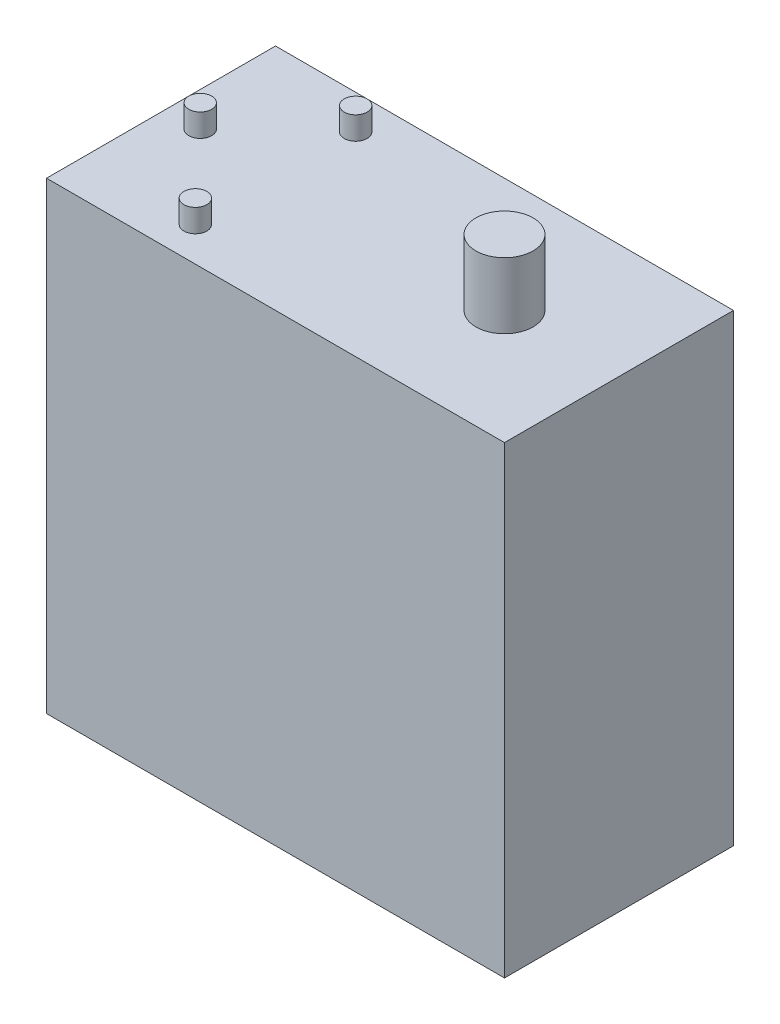
ISO-10303-21;
HEADER;
FILE_DESCRIPTION(('STEP AP214'),'2;1');
FILE_NAME('part.step','',(''),(''),'','','');
FILE_SCHEMA(('AUTOMOTIVE_DESIGN { 1 0 10303 214 1 1 1 1 }'));
ENDSEC;
DATA;
#1=APPLICATION_CONTEXT('core data for automotive mechanical design processes');
#2=APPLICATION_PROTOCOL_DEFINITION('international standard','automotive_design',2000,#1);
#3=PRODUCT_CONTEXT('',#1,'mechanical');
#4=PRODUCT('Part','Part','',(#3));
#5=PRODUCT_RELATED_PRODUCT_CATEGORY('part','',(#4));
#6=PRODUCT_DEFINITION_FORMATION('','',#4);
#7=PRODUCT_DEFINITION_CONTEXT('part definition',#1,'design');
#8=PRODUCT_DEFINITION('design','',#6,#7);
#9=PRODUCT_DEFINITION_SHAPE('','',#8);
#10=(LENGTH_UNIT() NAMED_UNIT(*) SI_UNIT(.MILLI.,.METRE.));
#11=(NAMED_UNIT(*) PLANE_ANGLE_UNIT() SI_UNIT($,.RADIAN.));
#12=(NAMED_UNIT(*) SI_UNIT($,.STERADIAN.) SOLID_ANGLE_UNIT());
#13=UNCERTAINTY_MEASURE_WITH_UNIT(LENGTH_MEASURE(1.E-05),#10,'distance_accuracy_value','');
#14=(GEOMETRIC_REPRESENTATION_CONTEXT(3) GLOBAL_UNCERTAINTY_ASSIGNED_CONTEXT((#13)) GLOBAL_UNIT_ASSIGNED_CONTEXT((#10,
#11,#12)) REPRESENTATION_CONTEXT('',''));
#15=CARTESIAN_POINT('',(0.,0.,0.));
#16=DIRECTION('',(0.,0.,1.));
#17=DIRECTION('',(1.,0.,0.));
#18=AXIS2_PLACEMENT_3D('',#15,#16,#17);
#19=CARTESIAN_POINT('',(-16.2432620080768,40.5,-10.7539016762014));
#20=DIRECTION('',(1.,0.,0.));
#21=DIRECTION('',(0.,0.,-1.));
#22=AXIS2_PLACEMENT_3D('',#19,#20,#21);
#23=PLANE('',#22);
#24=DIRECTION('',(0.,0.,1.));
#25=VECTOR('',#24,1.);
#26=CARTESIAN_POINT('',(-16.2432620080768,0.,-10.7539016762014));
#27=LINE('',#26,#25);
#28=CARTESIAN_POINT('',(-16.2432620080768,0.,-10.7539016762014));
#29=VERTEX_POINT('',#28);
#30=CARTESIAN_POINT('',(-16.2432620080768,0.,9.24609832379855));
#31=VERTEX_POINT('',#30);
#32=EDGE_CURVE('E106',#29,#31,#27,.T.);
#33=ORIENTED_EDGE('',*,*,#32,.T.);
#34=DIRECTION('',(0.,-1.,0.));
#35=VECTOR('',#34,1.);
#36=CARTESIAN_POINT('',(-16.2432620080768,40.5,9.24609832379855));
#37=LINE('',#36,#35);
#38=CARTESIAN_POINT('',(-16.2432620080768,40.5,9.24609832379855));
#39=VERTEX_POINT('',#38);
#40=EDGE_CURVE('E97',#39,#31,#37,.T.);
#41=ORIENTED_EDGE('',*,*,#40,.F.);
#42=DIRECTION('',(0.,0.,1.));
#43=VECTOR('',#42,1.);
#44=CARTESIAN_POINT('',(-16.2432620080768,40.5,-10.7539016762014));
#45=LINE('',#44,#43);
#46=CARTESIAN_POINT('',(-16.2432620080768,40.5,-10.7539016762014));
#47=VERTEX_POINT('',#46);
#48=EDGE_CURVE('E91',#47,#39,#45,.T.);
#49=ORIENTED_EDGE('',*,*,#48,.F.);
#50=DIRECTION('',(0.,-1.,0.));
#51=VECTOR('',#50,1.);
#52=CARTESIAN_POINT('',(-16.2432620080768,40.5,-10.7539016762014));
#53=LINE('',#52,#51);
#54=EDGE_CURVE('E102',#47,#29,#53,.T.);
#55=ORIENTED_EDGE('',*,*,#54,.T.);
#56=EDGE_LOOP('',(#33,#41,#49,#55));
#57=FACE_BOUND('',#56,.T.);
#58=ADVANCED_FACE('F37',(#57),#23,.F.);
#59=CARTESIAN_POINT('',(-16.2432620080768,40.5,9.24609832379855));
#60=DIRECTION('',(0.,0.,-1.));
#61=DIRECTION('',(-1.,0.,0.));
#62=AXIS2_PLACEMENT_3D('',#59,#60,#61);
#63=PLANE('',#62);
#64=DIRECTION('',(1.,0.,0.));
#65=VECTOR('',#64,1.);
#66=CARTESIAN_POINT('',(-16.2432620080768,0.,9.24609832379855));
#67=LINE('',#66,#65);
#68=CARTESIAN_POINT('',(23.7567379919232,0.,9.24609832379855));
#69=VERTEX_POINT('',#68);
#70=EDGE_CURVE('E96',#31,#69,#67,.T.);
#71=ORIENTED_EDGE('',*,*,#70,.T.);
#72=DIRECTION('',(0.,-1.,0.));
#73=VECTOR('',#72,1.);
#74=CARTESIAN_POINT('',(23.7567379919232,40.5,9.24609832379855));
#75=LINE('',#74,#73);
#76=CARTESIAN_POINT('',(23.7567379919232,40.5,9.24609832379855));
#77=VERTEX_POINT('',#76);
#78=EDGE_CURVE('E94',#77,#69,#75,.T.);
#79=ORIENTED_EDGE('',*,*,#78,.F.);
#80=DIRECTION('',(1.,0.,0.));
#81=VECTOR('',#80,1.);
#82=CARTESIAN_POINT('',(-16.2432620080768,40.5,9.24609832379855));
#83=LINE('',#82,#81);
#84=EDGE_CURVE('E86',#39,#77,#83,.T.);
#85=ORIENTED_EDGE('',*,*,#84,.F.);
#86=ORIENTED_EDGE('',*,*,#40,.T.);
#87=EDGE_LOOP('',(#71,#79,#85,#86));
#88=FACE_BOUND('',#87,.T.);
#89=ADVANCED_FACE('F95',(#88),#63,.F.);
#90=CARTESIAN_POINT('',(23.7567379919232,40.5,-10.7539016762014));
#91=DIRECTION('',(-1.,0.,0.));
#92=DIRECTION('',(0.,0.,1.));
#93=AXIS2_PLACEMENT_3D('',#90,#91,#92);
#94=PLANE('',#93);
#95=DIRECTION('',(0.,0.,-1.));
#96=VECTOR('',#95,1.);
#97=CARTESIAN_POINT('',(23.7567379919232,0.,-10.7539016762014));
#98=LINE('',#97,#96);
#99=CARTESIAN_POINT('',(23.7567379919232,0.,-10.7539016762014));
#100=VERTEX_POINT('',#99);
#101=EDGE_CURVE('E72',#69,#100,#98,.T.);
#102=ORIENTED_EDGE('',*,*,#101,.T.);
#103=DIRECTION('',(0.,-1.,0.));
#104=VECTOR('',#103,1.);
#105=CARTESIAN_POINT('',(23.7567379919232,40.5,-10.7539016762014));
#106=LINE('',#105,#104);
#107=CARTESIAN_POINT('',(23.7567379919232,40.5,-10.7539016762014));
#108=VERTEX_POINT('',#107);
#109=EDGE_CURVE('E98',#108,#100,#106,.T.);
#110=ORIENTED_EDGE('',*,*,#109,.F.);
#111=DIRECTION('',(0.,0.,-1.));
#112=VECTOR('',#111,1.);
#113=CARTESIAN_POINT('',(23.7567379919232,40.5,-10.7539016762014));
#114=LINE('',#113,#112);
#115=EDGE_CURVE('E89',#77,#108,#114,.T.);
#116=ORIENTED_EDGE('',*,*,#115,.F.);
#117=ORIENTED_EDGE('',*,*,#78,.T.);
#118=EDGE_LOOP('',(#102,#110,#116,#117));
#119=FACE_BOUND('',#118,.T.);
#120=ADVANCED_FACE('F100',(#119),#94,.F.);
#121=CARTESIAN_POINT('',(-16.2432620080768,40.5,-10.7539016762014));
#122=DIRECTION('',(0.,0.,1.));
#123=DIRECTION('',(1.,0.,0.));
#124=AXIS2_PLACEMENT_3D('',#121,#122,#123);
#125=PLANE('',#124);
#126=DIRECTION('',(-1.,0.,0.));
#127=VECTOR('',#126,1.);
#128=CARTESIAN_POINT('',(-16.2432620080768,0.,-10.7539016762014));
#129=LINE('',#128,#127);
#130=EDGE_CURVE('E78',#100,#29,#129,.T.);
#131=ORIENTED_EDGE('',*,*,#130,.T.);
#132=ORIENTED_EDGE('',*,*,#54,.F.);
#133=DIRECTION('',(-1.,0.,0.));
#134=VECTOR('',#133,1.);
#135=CARTESIAN_POINT('',(-16.2432620080768,40.5,-10.7539016762014));
#136=LINE('',#135,#134);
#137=EDGE_CURVE('E55',#108,#47,#136,.T.);
#138=ORIENTED_EDGE('',*,*,#137,.F.);
#139=ORIENTED_EDGE('',*,*,#109,.T.);
#140=EDGE_LOOP('',(#131,#132,#138,#139));
#141=FACE_BOUND('',#140,.T.);
#142=ADVANCED_FACE('F159',(#141),#125,.F.);
#143=CARTESIAN_POINT('',(0.,40.5,0.));
#144=DIRECTION('',(0.,1.,0.));
#145=DIRECTION('',(0.,0.,1.));
#146=AXIS2_PLACEMENT_3D('',#143,#144,#145);
#147=PLANE('',#146);
#148=CARTESIAN_POINT('',(-6.24326200807684,40.5,6.24609832379855));
#149=DIRECTION('',(0.,1.,0.));
#150=DIRECTION('',(0.,0.,1.));
#151=AXIS2_PLACEMENT_3D('',#148,#149,#150);
#152=CIRCLE('',#151,1.);
#153=CARTESIAN_POINT('',(-6.24326200807684,40.5,7.24609832379856));
#154=VERTEX_POINT('',#153);
#155=EDGE_CURVE('E11',#154,#154,#152,.T.);
#156=ORIENTED_EDGE('',*,*,#155,.F.);
#157=EDGE_LOOP('',(#156));
#158=FACE_BOUND('',#157,.T.);
#159=CARTESIAN_POINT('',(-6.24326200807684,40.5,-7.75390167620145));
#160=DIRECTION('',(0.,1.,0.));
#161=DIRECTION('',(0.,0.,1.));
#162=AXIS2_PLACEMENT_3D('',#159,#160,#161);
#163=CIRCLE('',#162,1.);
#164=CARTESIAN_POINT('',(-6.24326200807684,40.5,-6.75390167620144));
#165=VERTEX_POINT('',#164);
#166=EDGE_CURVE('E46',#165,#165,#163,.T.);
#167=ORIENTED_EDGE('',*,*,#166,.F.);
#168=EDGE_LOOP('',(#167));
#169=FACE_BOUND('',#168,.T.);
#170=CARTESIAN_POINT('',(-13.2432620080768,40.5,-1.18077609255351));
#171=DIRECTION('',(0.,1.,0.));
#172=DIRECTION('',(0.,0.,1.));
#173=AXIS2_PLACEMENT_3D('',#170,#171,#172);
#174=CIRCLE('',#173,1.);
#175=CARTESIAN_POINT('',(-13.2432620080768,40.5,-0.180776092553513));
#176=VERTEX_POINT('',#175);
#177=EDGE_CURVE('E141',#176,#176,#174,.T.);
#178=ORIENTED_EDGE('',*,*,#177,.F.);
#179=EDGE_LOOP('',(#178));
#180=FACE_BOUND('',#179,.T.);
#181=CARTESIAN_POINT('',(13.7567379919232,40.5,-0.753901676201447));
#182=DIRECTION('',(0.,1.,0.));
#183=DIRECTION('',(0.,0.,1.));
#184=AXIS2_PLACEMENT_3D('',#181,#182,#183);
#185=CIRCLE('',#184,2.5);
#186=CARTESIAN_POINT('',(13.7567379919232,40.5,1.74609832379855));
#187=VERTEX_POINT('',#186);
#188=EDGE_CURVE('E116',#187,#187,#185,.T.);
#189=ORIENTED_EDGE('',*,*,#188,.F.);
#190=EDGE_LOOP('',(#189));
#191=FACE_BOUND('',#190,.T.);
#192=ORIENTED_EDGE('',*,*,#48,.T.);
#193=ORIENTED_EDGE('',*,*,#84,.T.);
#194=ORIENTED_EDGE('',*,*,#115,.T.);
#195=ORIENTED_EDGE('',*,*,#137,.T.);
#196=EDGE_LOOP('',(#192,#193,#194,#195));
#197=FACE_BOUND('',#196,.T.);
#198=ADVANCED_FACE('F87',(#158,#169,#180,#191,#197),#147,.T.);
#199=CARTESIAN_POINT('',(0.,0.,0.));
#200=DIRECTION('',(0.,1.,0.));
#201=DIRECTION('',(0.,0.,1.));
#202=AXIS2_PLACEMENT_3D('',#199,#200,#201);
#203=PLANE('',#202);
#204=CARTESIAN_POINT('',(-6.24326200807684,0.,6.24609832379855));
#205=DIRECTION('',(0.,1.,0.));
#206=DIRECTION('',(0.,0.,1.));
#207=AXIS2_PLACEMENT_3D('',#204,#205,#206);
#208=CIRCLE('',#207,1.);
#209=CARTESIAN_POINT('',(-6.24326200807684,0.,7.24609832379856));
#210=VERTEX_POINT('',#209);
#211=EDGE_CURVE('E40',#210,#210,#208,.T.);
#212=ORIENTED_EDGE('',*,*,#211,.T.);
#213=EDGE_LOOP('',(#212));
#214=FACE_BOUND('',#213,.T.);
#215=CARTESIAN_POINT('',(-6.24326200807684,0.,-7.75390167620145));
#216=DIRECTION('',(0.,1.,0.));
#217=DIRECTION('',(0.,0.,1.));
#218=AXIS2_PLACEMENT_3D('',#215,#216,#217);
#219=CIRCLE('',#218,1.);
#220=CARTESIAN_POINT('',(-6.24326200807684,0.,-6.75390167620144));
#221=VERTEX_POINT('',#220);
#222=EDGE_CURVE('E124',#221,#221,#219,.T.);
#223=ORIENTED_EDGE('',*,*,#222,.T.);
#224=EDGE_LOOP('',(#223));
#225=FACE_BOUND('',#224,.T.);
#226=CARTESIAN_POINT('',(-13.2432620080768,0.,-1.18077609255351));
#227=DIRECTION('',(0.,1.,0.));
#228=DIRECTION('',(0.,0.,1.));
#229=AXIS2_PLACEMENT_3D('',#226,#227,#228);
#230=CIRCLE('',#229,1.);
#231=CARTESIAN_POINT('',(-13.2432620080768,0.,-0.180776092553513));
#232=VERTEX_POINT('',#231);
#233=EDGE_CURVE('E120',#232,#232,#230,.T.);
#234=ORIENTED_EDGE('',*,*,#233,.T.);
#235=EDGE_LOOP('',(#234));
#236=FACE_BOUND('',#235,.T.);
#237=CARTESIAN_POINT('',(13.7567379919232,0.,-0.753901676201447));
#238=DIRECTION('',(0.,1.,0.));
#239=DIRECTION('',(0.,0.,1.));
#240=AXIS2_PLACEMENT_3D('',#237,#238,#239);
#241=CIRCLE('',#240,2.5);
#242=CARTESIAN_POINT('',(13.7567379919232,0.,1.74609832379855));
#243=VERTEX_POINT('',#242);
#244=EDGE_CURVE('E109',#243,#243,#241,.T.);
#245=ORIENTED_EDGE('',*,*,#244,.T.);
#246=EDGE_LOOP('',(#245));
#247=FACE_BOUND('',#246,.T.);
#248=ORIENTED_EDGE('',*,*,#32,.F.);
#249=ORIENTED_EDGE('',*,*,#130,.F.);
#250=ORIENTED_EDGE('',*,*,#101,.F.);
#251=ORIENTED_EDGE('',*,*,#70,.F.);
#252=EDGE_LOOP('',(#248,#249,#250,#251));
#253=FACE_BOUND('',#252,.T.);
#254=ADVANCED_FACE('F158',(#214,#225,#236,#247,#253),#203,.F.);
#255=CARTESIAN_POINT('',(13.7567379919232,-5.75,-0.753901676201447));
#256=DIRECTION('',(0.,1.,0.));
#257=DIRECTION('',(0.,0.,1.));
#258=AXIS2_PLACEMENT_3D('',#255,#256,#257);
#259=PLANE('',#258);
#260=CARTESIAN_POINT('',(13.7567379919232,-5.75,-0.753901676201447));
#261=DIRECTION('',(0.,1.,0.));
#262=DIRECTION('',(0.,0.,1.));
#263=AXIS2_PLACEMENT_3D('',#260,#261,#262);
#264=CIRCLE('',#263,2.5);
#265=CARTESIAN_POINT('',(13.7567379919232,-5.75,1.74609832379855));
#266=VERTEX_POINT('',#265);
#267=EDGE_CURVE('E119',#266,#266,#264,.T.);
#268=ORIENTED_EDGE('',*,*,#267,.F.);
#269=EDGE_LOOP('',(#268));
#270=FACE_BOUND('',#269,.T.);
#271=ADVANCED_FACE('F166',(#270),#259,.F.);
#272=CARTESIAN_POINT('',(13.7567379919232,-5.75,-0.753901676201447));
#273=DIRECTION('',(0.,1.,0.));
#274=DIRECTION('',(0.,0.,1.));
#275=AXIS2_PLACEMENT_3D('',#272,#273,#274);
#276=CYLINDRICAL_SURFACE('',#275,2.5);
#277=ORIENTED_EDGE('',*,*,#267,.T.);
#278=EDGE_LOOP('',(#277));
#279=FACE_BOUND('',#278,.T.);
#280=ORIENTED_EDGE('',*,*,#244,.F.);
#281=EDGE_LOOP('',(#280));
#282=FACE_BOUND('',#281,.T.);
#283=ADVANCED_FACE('F200',(#279,#282),#276,.T.);
#284=ORIENTED_EDGE('',*,*,#188,.T.);
#285=EDGE_LOOP('',(#284));
#286=FACE_BOUND('',#285,.T.);
#287=CARTESIAN_POINT('',(13.7567379919232,46.25,-0.753901676201447));
#288=DIRECTION('',(0.,1.,0.));
#289=DIRECTION('',(0.,0.,1.));
#290=AXIS2_PLACEMENT_3D('',#287,#288,#289);
#291=CIRCLE('',#290,2.5);
#292=CARTESIAN_POINT('',(13.7567379919232,46.25,1.74609832379855));
#293=VERTEX_POINT('',#292);
#294=EDGE_CURVE('E122',#293,#293,#291,.T.);
#295=ORIENTED_EDGE('',*,*,#294,.F.);
#296=EDGE_LOOP('',(#295));
#297=FACE_BOUND('',#296,.T.);
#298=ADVANCED_FACE('F154',(#286,#297),#276,.T.);
#299=CARTESIAN_POINT('',(13.7567379919232,46.25,-0.753901676201447));
#300=DIRECTION('',(0.,1.,0.));
#301=DIRECTION('',(0.,0.,1.));
#302=AXIS2_PLACEMENT_3D('',#299,#300,#301);
#303=PLANE('',#302);
#304=ORIENTED_EDGE('',*,*,#294,.T.);
#305=EDGE_LOOP('',(#304));
#306=FACE_BOUND('',#305,.T.);
#307=ADVANCED_FACE('F219',(#306),#303,.T.);
#308=CARTESIAN_POINT('',(-13.2432620080768,-2.,-1.18077609255351));
#309=DIRECTION('',(0.,1.,0.));
#310=DIRECTION('',(0.,0.,1.));
#311=AXIS2_PLACEMENT_3D('',#308,#309,#310);
#312=PLANE('',#311);
#313=CARTESIAN_POINT('',(-13.2432620080768,-2.,-1.18077609255351));
#314=DIRECTION('',(0.,1.,0.));
#315=DIRECTION('',(0.,0.,1.));
#316=AXIS2_PLACEMENT_3D('',#313,#314,#315);
#317=CIRCLE('',#316,1.);
#318=CARTESIAN_POINT('',(-13.2432620080768,-2.,-0.180776092553513));
#319=VERTEX_POINT('',#318);
#320=EDGE_CURVE('E123',#319,#319,#317,.T.);
#321=ORIENTED_EDGE('',*,*,#320,.F.);
#322=EDGE_LOOP('',(#321));
#323=FACE_BOUND('',#322,.T.);
#324=ADVANCED_FACE('F226',(#323),#312,.F.);
#325=CARTESIAN_POINT('',(-13.2432620080768,-2.,-1.18077609255351));
#326=DIRECTION('',(0.,1.,0.));
#327=DIRECTION('',(0.,0.,1.));
#328=AXIS2_PLACEMENT_3D('',#325,#326,#327);
#329=CYLINDRICAL_SURFACE('',#328,1.);
#330=ORIENTED_EDGE('',*,*,#320,.T.);
#331=EDGE_LOOP('',(#330));
#332=FACE_BOUND('',#331,.T.);
#333=ORIENTED_EDGE('',*,*,#233,.F.);
#334=EDGE_LOOP('',(#333));
#335=FACE_BOUND('',#334,.T.);
#336=ADVANCED_FACE('F245',(#332,#335),#329,.T.);
#337=ORIENTED_EDGE('',*,*,#177,.T.);
#338=EDGE_LOOP('',(#337));
#339=FACE_BOUND('',#338,.T.);
#340=CARTESIAN_POINT('',(-13.2432620080768,42.5,-1.18077609255351));
#341=DIRECTION('',(0.,1.,0.));
#342=DIRECTION('',(0.,0.,1.));
#343=AXIS2_PLACEMENT_3D('',#340,#341,#342);
#344=CIRCLE('',#343,1.);
#345=CARTESIAN_POINT('',(-13.2432620080768,42.5,-0.180776092553513));
#346=VERTEX_POINT('',#345);
#347=EDGE_CURVE('E126',#346,#346,#344,.T.);
#348=ORIENTED_EDGE('',*,*,#347,.F.);
#349=EDGE_LOOP('',(#348));
#350=FACE_BOUND('',#349,.T.);
#351=ADVANCED_FACE('F255',(#339,#350),#329,.T.);
#352=CARTESIAN_POINT('',(-13.2432620080768,42.5,-1.18077609255351));
#353=DIRECTION('',(0.,1.,0.));
#354=DIRECTION('',(0.,0.,1.));
#355=AXIS2_PLACEMENT_3D('',#352,#353,#354);
#356=PLANE('',#355);
#357=ORIENTED_EDGE('',*,*,#347,.T.);
#358=EDGE_LOOP('',(#357));
#359=FACE_BOUND('',#358,.T.);
#360=ADVANCED_FACE('F265',(#359),#356,.T.);
#361=CARTESIAN_POINT('',(-6.24326200807684,-2.,-7.75390167620145));
#362=DIRECTION('',(0.,1.,0.));
#363=DIRECTION('',(0.,0.,1.));
#364=AXIS2_PLACEMENT_3D('',#361,#362,#363);
#365=PLANE('',#364);
#366=CARTESIAN_POINT('',(-6.24326200807684,-2.,-7.75390167620145));
#367=DIRECTION('',(0.,1.,0.));
#368=DIRECTION('',(0.,0.,1.));
#369=AXIS2_PLACEMENT_3D('',#366,#367,#368);
#370=CIRCLE('',#369,1.);
#371=CARTESIAN_POINT('',(-6.24326200807684,-2.,-6.75390167620144));
#372=VERTEX_POINT('',#371);
#373=EDGE_CURVE('E127',#372,#372,#370,.T.);
#374=ORIENTED_EDGE('',*,*,#373,.F.);
#375=EDGE_LOOP('',(#374));
#376=FACE_BOUND('',#375,.T.);
#377=ADVANCED_FACE('F274',(#376),#365,.F.);
#378=CARTESIAN_POINT('',(-6.24326200807684,-2.,-7.75390167620145));
#379=DIRECTION('',(0.,1.,0.));
#380=DIRECTION('',(0.,0.,1.));
#381=AXIS2_PLACEMENT_3D('',#378,#379,#380);
#382=CYLINDRICAL_SURFACE('',#381,1.);
#383=ORIENTED_EDGE('',*,*,#373,.T.);
#384=EDGE_LOOP('',(#383));
#385=FACE_BOUND('',#384,.T.);
#386=ORIENTED_EDGE('',*,*,#222,.F.);
#387=EDGE_LOOP('',(#386));
#388=FACE_BOUND('',#387,.T.);
#389=ADVANCED_FACE('F284',(#385,#388),#382,.T.);
#390=ORIENTED_EDGE('',*,*,#166,.T.);
#391=EDGE_LOOP('',(#390));
#392=FACE_BOUND('',#391,.T.);
#393=CARTESIAN_POINT('',(-6.24326200807684,42.5,-7.75390167620145));
#394=DIRECTION('',(0.,1.,0.));
#395=DIRECTION('',(0.,0.,1.));
#396=AXIS2_PLACEMENT_3D('',#393,#394,#395);
#397=CIRCLE('',#396,1.);
#398=CARTESIAN_POINT('',(-6.24326200807684,42.5,-6.75390167620144));
#399=VERTEX_POINT('',#398);
#400=EDGE_CURVE('E133',#399,#399,#397,.T.);
#401=ORIENTED_EDGE('',*,*,#400,.F.);
#402=EDGE_LOOP('',(#401));
#403=FACE_BOUND('',#402,.T.);
#404=ADVANCED_FACE('F294',(#392,#403),#382,.T.);
#405=CARTESIAN_POINT('',(-6.24326200807684,42.5,-7.75390167620145));
#406=DIRECTION('',(0.,1.,0.));
#407=DIRECTION('',(0.,0.,1.));
#408=AXIS2_PLACEMENT_3D('',#405,#406,#407);
#409=PLANE('',#408);
#410=ORIENTED_EDGE('',*,*,#400,.T.);
#411=EDGE_LOOP('',(#410));
#412=FACE_BOUND('',#411,.T.);
#413=ADVANCED_FACE('F303',(#412),#409,.T.);
#414=CARTESIAN_POINT('',(-6.24326200807684,-2.,6.24609832379855));
#415=DIRECTION('',(0.,1.,0.));
#416=DIRECTION('',(0.,0.,1.));
#417=AXIS2_PLACEMENT_3D('',#414,#415,#416);
#418=PLANE('',#417);
#419=CARTESIAN_POINT('',(-6.24326200807684,-2.,6.24609832379855));
#420=DIRECTION('',(0.,1.,0.));
#421=DIRECTION('',(0.,0.,1.));
#422=AXIS2_PLACEMENT_3D('',#419,#420,#421);
#423=CIRCLE('',#422,1.);
#424=CARTESIAN_POINT('',(-6.24326200807684,-2.,7.24609832379856));
#425=VERTEX_POINT('',#424);
#426=EDGE_CURVE('E359',#425,#425,#423,.T.);
#427=ORIENTED_EDGE('',*,*,#426,.F.);
#428=EDGE_LOOP('',(#427));
#429=FACE_BOUND('',#428,.T.);
#430=ADVANCED_FACE('F312',(#429),#418,.F.);
#431=CARTESIAN_POINT('',(-6.24326200807684,-2.,6.24609832379855));
#432=DIRECTION('',(0.,1.,0.));
#433=DIRECTION('',(0.,0.,1.));
#434=AXIS2_PLACEMENT_3D('',#431,#432,#433);
#435=CYLINDRICAL_SURFACE('',#434,1.);
#436=ORIENTED_EDGE('',*,*,#426,.T.);
#437=EDGE_LOOP('',(#436));
#438=FACE_BOUND('',#437,.T.);
#439=ORIENTED_EDGE('',*,*,#211,.F.);
#440=EDGE_LOOP('',(#439));
#441=FACE_BOUND('',#440,.T.);
#442=ADVANCED_FACE('F322',(#438,#441),#435,.T.);
#443=ORIENTED_EDGE('',*,*,#155,.T.);
#444=EDGE_LOOP('',(#443));
#445=FACE_BOUND('',#444,.T.);
#446=CARTESIAN_POINT('',(-6.24326200807684,42.5,6.24609832379855));
#447=DIRECTION('',(0.,1.,0.));
#448=DIRECTION('',(0.,0.,1.));
#449=AXIS2_PLACEMENT_3D('',#446,#447,#448);
#450=CIRCLE('',#449,1.);
#451=CARTESIAN_POINT('',(-6.24326200807684,42.5,7.24609832379856));
#452=VERTEX_POINT('',#451);
#453=EDGE_CURVE('E357',#452,#452,#450,.T.);
#454=ORIENTED_EDGE('',*,*,#453,.F.);
#455=EDGE_LOOP('',(#454));
#456=FACE_BOUND('',#455,.T.);
#457=ADVANCED_FACE('F332',(#445,#456),#435,.T.);
#458=CARTESIAN_POINT('',(-6.24326200807684,42.5,6.24609832379855));
#459=DIRECTION('',(0.,1.,0.));
#460=DIRECTION('',(0.,0.,1.));
#461=AXIS2_PLACEMENT_3D('',#458,#459,#460);
#462=PLANE('',#461);
#463=ORIENTED_EDGE('',*,*,#453,.T.);
#464=EDGE_LOOP('',(#463));
#465=FACE_BOUND('',#464,.T.);
#466=ADVANCED_FACE('F342',(#465),#462,.T.);
#467=CLOSED_SHELL('',(#58,#89,#120,#142,#198,#254,#271,#283,#298,#307,#324,#336,#351,#360,#377,
#389,#404,#413,#430,#442,#457,#466));
#468=MANIFOLD_SOLID_BREP('B2',#467);
#469=ADVANCED_BREP_SHAPE_REPRESENTATION('',(#18,#468),#14);
#470=SHAPE_DEFINITION_REPRESENTATION(#9,#469);
ENDSEC;
END-ISO-10303-21;
